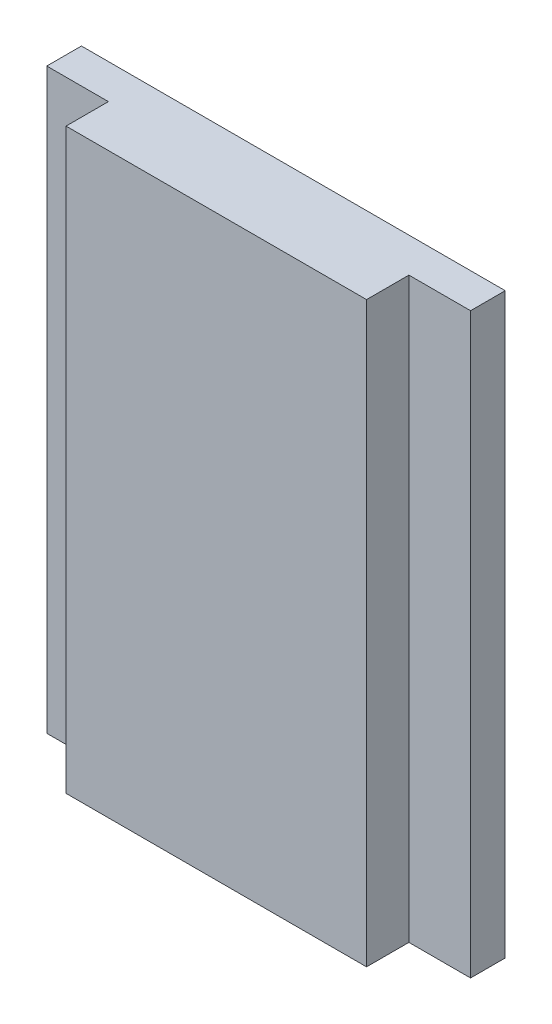
ISO-10303-21;
HEADER;
FILE_DESCRIPTION(('STEP AP214'),'2;1');
FILE_NAME('part.step','',(''),(''),'','','');
FILE_SCHEMA(('AUTOMOTIVE_DESIGN { 1 0 10303 214 1 1 1 1 }'));
ENDSEC;
DATA;
#1=APPLICATION_CONTEXT('core data for automotive mechanical design processes');
#2=APPLICATION_PROTOCOL_DEFINITION('international standard','automotive_design',2000,#1);
#3=PRODUCT_CONTEXT('',#1,'mechanical');
#4=PRODUCT('Part','Part','',(#3));
#5=PRODUCT_RELATED_PRODUCT_CATEGORY('part','',(#4));
#6=PRODUCT_DEFINITION_FORMATION('','',#4);
#7=PRODUCT_DEFINITION_CONTEXT('part definition',#1,'design');
#8=PRODUCT_DEFINITION('design','',#6,#7);
#9=PRODUCT_DEFINITION_SHAPE('','',#8);
#10=(LENGTH_UNIT() NAMED_UNIT(*) SI_UNIT(.MILLI.,.METRE.));
#11=(NAMED_UNIT(*) PLANE_ANGLE_UNIT() SI_UNIT($,.RADIAN.));
#12=(NAMED_UNIT(*) SI_UNIT($,.STERADIAN.) SOLID_ANGLE_UNIT());
#13=UNCERTAINTY_MEASURE_WITH_UNIT(LENGTH_MEASURE(1.E-05),#10,'distance_accuracy_value','');
#14=(GEOMETRIC_REPRESENTATION_CONTEXT(3) GLOBAL_UNCERTAINTY_ASSIGNED_CONTEXT((#13)) GLOBAL_UNIT_ASSIGNED_CONTEXT((#10,
#11,#12)) REPRESENTATION_CONTEXT('',''));
#15=CARTESIAN_POINT('',(0.,0.,0.));
#16=DIRECTION('',(0.,0.,1.));
#17=DIRECTION('',(1.,0.,0.));
#18=AXIS2_PLACEMENT_3D('',#15,#16,#17);
#19=CARTESIAN_POINT('',(-15.15,-7.5,-13.));
#20=DIRECTION('',(0.,0.,1.));
#21=DIRECTION('',(1.,0.,0.));
#22=AXIS2_PLACEMENT_3D('',#19,#20,#21);
#23=PLANE('',#22);
#24=DIRECTION('',(1.,0.,0.));
#25=VECTOR('',#24,1.);
#26=CARTESIAN_POINT('',(-15.15,7.5,-13.));
#27=LINE('',#26,#25);
#28=CARTESIAN_POINT('',(-15.15,7.5,-13.));
#29=VERTEX_POINT('',#28);
#30=CARTESIAN_POINT('',(-7.35,7.5,-13.));
#31=VERTEX_POINT('',#30);
#32=EDGE_CURVE('E113',#29,#31,#27,.T.);
#33=ORIENTED_EDGE('',*,*,#32,.F.);
#34=DIRECTION('',(0.,1.,0.));
#35=VECTOR('',#34,1.);
#36=CARTESIAN_POINT('',(-15.15,-7.5,-13.));
#37=LINE('',#36,#35);
#38=CARTESIAN_POINT('',(-15.15,-7.5,-13.));
#39=VERTEX_POINT('',#38);
#40=EDGE_CURVE('E11',#39,#29,#37,.T.);
#41=ORIENTED_EDGE('',*,*,#40,.F.);
#42=DIRECTION('',(1.,0.,0.));
#43=VECTOR('',#42,1.);
#44=CARTESIAN_POINT('',(-15.15,-7.5,-13.));
#45=LINE('',#44,#43);
#46=CARTESIAN_POINT('',(-7.35,-7.5,-13.));
#47=VERTEX_POINT('',#46);
#48=EDGE_CURVE('E152',#39,#47,#45,.T.);
#49=ORIENTED_EDGE('',*,*,#48,.T.);
#50=DIRECTION('',(0.,1.,0.));
#51=VECTOR('',#50,1.);
#52=CARTESIAN_POINT('',(-7.35,-7.5,-13.));
#53=LINE('',#52,#51);
#54=EDGE_CURVE('E140',#47,#31,#53,.T.);
#55=ORIENTED_EDGE('',*,*,#54,.T.);
#56=EDGE_LOOP('',(#33,#41,#49,#55));
#57=FACE_BOUND('',#56,.T.);
#58=ADVANCED_FACE('F36',(#57),#23,.T.);
#59=CARTESIAN_POINT('',(-15.15,-7.5,-14.1));
#60=DIRECTION('',(-1.,0.,0.));
#61=DIRECTION('',(0.,0.,1.));
#62=AXIS2_PLACEMENT_3D('',#59,#60,#61);
#63=PLANE('',#62);
#64=DIRECTION('',(0.,0.,1.));
#65=VECTOR('',#64,1.);
#66=CARTESIAN_POINT('',(-15.15,7.5,-14.1));
#67=LINE('',#66,#65);
#68=CARTESIAN_POINT('',(-15.15,7.5,-14.1));
#69=VERTEX_POINT('',#68);
#70=EDGE_CURVE('E161',#69,#29,#67,.T.);
#71=ORIENTED_EDGE('',*,*,#70,.F.);
#72=DIRECTION('',(0.,1.,0.));
#73=VECTOR('',#72,1.);
#74=CARTESIAN_POINT('',(-15.15,-7.5,-14.1));
#75=LINE('',#74,#73);
#76=CARTESIAN_POINT('',(-15.15,-7.5,-14.1));
#77=VERTEX_POINT('',#76);
#78=EDGE_CURVE('E46',#77,#69,#75,.T.);
#79=ORIENTED_EDGE('',*,*,#78,.F.);
#80=DIRECTION('',(0.,0.,1.));
#81=VECTOR('',#80,1.);
#82=CARTESIAN_POINT('',(-15.15,-7.5,-14.1));
#83=LINE('',#82,#81);
#84=EDGE_CURVE('E150',#77,#39,#83,.T.);
#85=ORIENTED_EDGE('',*,*,#84,.T.);
#86=ORIENTED_EDGE('',*,*,#40,.T.);
#87=EDGE_LOOP('',(#71,#79,#85,#86));
#88=FACE_BOUND('',#87,.T.);
#89=ADVANCED_FACE('F181',(#88),#63,.T.);
#90=CARTESIAN_POINT('',(-16.75,-7.5,-14.1));
#91=DIRECTION('',(0.,0.,1.));
#92=DIRECTION('',(1.,0.,0.));
#93=AXIS2_PLACEMENT_3D('',#90,#91,#92);
#94=PLANE('',#93);
#95=DIRECTION('',(1.,0.,0.));
#96=VECTOR('',#95,1.);
#97=CARTESIAN_POINT('',(-16.75,7.5,-14.1));
#98=LINE('',#97,#96);
#99=CARTESIAN_POINT('',(-16.75,7.5,-14.1));
#100=VERTEX_POINT('',#99);
#101=EDGE_CURVE('E158',#100,#69,#98,.T.);
#102=ORIENTED_EDGE('',*,*,#101,.F.);
#103=DIRECTION('',(0.,1.,0.));
#104=VECTOR('',#103,1.);
#105=CARTESIAN_POINT('',(-16.75,-7.5,-14.1));
#106=LINE('',#105,#104);
#107=CARTESIAN_POINT('',(-16.75,-7.5,-14.1));
#108=VERTEX_POINT('',#107);
#109=EDGE_CURVE('E164',#108,#100,#106,.T.);
#110=ORIENTED_EDGE('',*,*,#109,.F.);
#111=DIRECTION('',(1.,0.,0.));
#112=VECTOR('',#111,1.);
#113=CARTESIAN_POINT('',(-16.75,-7.5,-14.1));
#114=LINE('',#113,#112);
#115=EDGE_CURVE('E148',#108,#77,#114,.T.);
#116=ORIENTED_EDGE('',*,*,#115,.T.);
#117=ORIENTED_EDGE('',*,*,#78,.T.);
#118=EDGE_LOOP('',(#102,#110,#116,#117));
#119=FACE_BOUND('',#118,.T.);
#120=ADVANCED_FACE('F182',(#119),#94,.T.);
#121=CARTESIAN_POINT('',(-16.75,-7.5,-15.));
#122=DIRECTION('',(-1.,0.,0.));
#123=DIRECTION('',(0.,0.,1.));
#124=AXIS2_PLACEMENT_3D('',#121,#122,#123);
#125=PLANE('',#124);
#126=DIRECTION('',(0.,0.,1.));
#127=VECTOR('',#126,1.);
#128=CARTESIAN_POINT('',(-16.75,7.5,-15.));
#129=LINE('',#128,#127);
#130=CARTESIAN_POINT('',(-16.75,7.5,-15.));
#131=VERTEX_POINT('',#130);
#132=EDGE_CURVE('E155',#131,#100,#129,.T.);
#133=ORIENTED_EDGE('',*,*,#132,.F.);
#134=DIRECTION('',(0.,1.,0.));
#135=VECTOR('',#134,1.);
#136=CARTESIAN_POINT('',(-16.75,-7.5,-15.));
#137=LINE('',#136,#135);
#138=CARTESIAN_POINT('',(-16.75,-7.5,-15.));
#139=VERTEX_POINT('',#138);
#140=EDGE_CURVE('E40',#139,#131,#137,.T.);
#141=ORIENTED_EDGE('',*,*,#140,.F.);
#142=DIRECTION('',(0.,0.,1.));
#143=VECTOR('',#142,1.);
#144=CARTESIAN_POINT('',(-16.75,-7.5,-15.));
#145=LINE('',#144,#143);
#146=EDGE_CURVE('E112',#139,#108,#145,.T.);
#147=ORIENTED_EDGE('',*,*,#146,.T.);
#148=ORIENTED_EDGE('',*,*,#109,.T.);
#149=EDGE_LOOP('',(#133,#141,#147,#148));
#150=FACE_BOUND('',#149,.T.);
#151=ADVANCED_FACE('F167',(#150),#125,.T.);
#152=CARTESIAN_POINT('',(-15.15,-7.5,-15.));
#153=DIRECTION('',(0.,0.,-1.));
#154=DIRECTION('',(-1.,0.,0.));
#155=AXIS2_PLACEMENT_3D('',#152,#153,#154);
#156=PLANE('',#155);
#157=DIRECTION('',(-1.,0.,0.));
#158=VECTOR('',#157,1.);
#159=CARTESIAN_POINT('',(-15.15,7.5,-15.));
#160=LINE('',#159,#158);
#161=CARTESIAN_POINT('',(-5.75000000000001,7.5,-15.));
#162=VERTEX_POINT('',#161);
#163=EDGE_CURVE('E118',#162,#131,#160,.T.);
#164=ORIENTED_EDGE('',*,*,#163,.F.);
#165=DIRECTION('',(0.,1.,0.));
#166=VECTOR('',#165,1.);
#167=CARTESIAN_POINT('',(-5.75000000000001,-7.5,-15.));
#168=LINE('',#167,#166);
#169=CARTESIAN_POINT('',(-5.75000000000001,-7.5,-15.));
#170=VERTEX_POINT('',#169);
#171=EDGE_CURVE('E116',#170,#162,#168,.T.);
#172=ORIENTED_EDGE('',*,*,#171,.F.);
#173=DIRECTION('',(-1.,0.,0.));
#174=VECTOR('',#173,1.);
#175=CARTESIAN_POINT('',(-11.25,-7.5,-15.));
#176=LINE('',#175,#174);
#177=EDGE_CURVE('E80',#170,#139,#176,.T.);
#178=ORIENTED_EDGE('',*,*,#177,.T.);
#179=ORIENTED_EDGE('',*,*,#140,.T.);
#180=EDGE_LOOP('',(#164,#172,#178,#179));
#181=FACE_BOUND('',#180,.T.);
#182=ADVANCED_FACE('F38',(#181),#156,.T.);
#183=CARTESIAN_POINT('',(0.,-7.5,0.));
#184=DIRECTION('',(0.,1.,0.));
#185=DIRECTION('',(0.,0.,1.));
#186=AXIS2_PLACEMENT_3D('',#183,#184,#185);
#187=PLANE('',#186);
#188=ORIENTED_EDGE('',*,*,#177,.F.);
#189=DIRECTION('',(0.,0.,1.));
#190=VECTOR('',#189,1.);
#191=CARTESIAN_POINT('',(-5.75000000000001,-7.5,-15.));
#192=LINE('',#191,#190);
#193=CARTESIAN_POINT('',(-5.75000000000001,-7.5,-14.1));
#194=VERTEX_POINT('',#193);
#195=EDGE_CURVE('E108',#170,#194,#192,.T.);
#196=ORIENTED_EDGE('',*,*,#195,.T.);
#197=DIRECTION('',(-1.,0.,0.));
#198=VECTOR('',#197,1.);
#199=CARTESIAN_POINT('',(-5.75000000000001,-7.5,-14.1));
#200=LINE('',#199,#198);
#201=CARTESIAN_POINT('',(-7.35,-7.5,-14.1));
#202=VERTEX_POINT('',#201);
#203=EDGE_CURVE('E127',#194,#202,#200,.T.);
#204=ORIENTED_EDGE('',*,*,#203,.T.);
#205=DIRECTION('',(0.,0.,1.));
#206=VECTOR('',#205,1.);
#207=CARTESIAN_POINT('',(-7.35,-7.5,-14.1));
#208=LINE('',#207,#206);
#209=EDGE_CURVE('E122',#202,#47,#208,.T.);
#210=ORIENTED_EDGE('',*,*,#209,.T.);
#211=ORIENTED_EDGE('',*,*,#48,.F.);
#212=ORIENTED_EDGE('',*,*,#84,.F.);
#213=ORIENTED_EDGE('',*,*,#115,.F.);
#214=ORIENTED_EDGE('',*,*,#146,.F.);
#215=EDGE_LOOP('',(#188,#196,#204,#210,#211,#212,#213,#214));
#216=FACE_BOUND('',#215,.T.);
#217=ADVANCED_FACE('F106',(#216),#187,.F.);
#218=CARTESIAN_POINT('',(0.,7.5,0.));
#219=DIRECTION('',(0.,1.,0.));
#220=DIRECTION('',(0.,0.,1.));
#221=AXIS2_PLACEMENT_3D('',#218,#219,#220);
#222=PLANE('',#221);
#223=ORIENTED_EDGE('',*,*,#32,.T.);
#224=DIRECTION('',(0.,0.,1.));
#225=VECTOR('',#224,1.);
#226=CARTESIAN_POINT('',(-7.35,7.5,-14.1));
#227=LINE('',#226,#225);
#228=CARTESIAN_POINT('',(-7.35,7.5,-14.1));
#229=VERTEX_POINT('',#228);
#230=EDGE_CURVE('E128',#229,#31,#227,.T.);
#231=ORIENTED_EDGE('',*,*,#230,.F.);
#232=DIRECTION('',(-1.,0.,0.));
#233=VECTOR('',#232,1.);
#234=CARTESIAN_POINT('',(-5.75000000000001,7.5,-14.1));
#235=LINE('',#234,#233);
#236=CARTESIAN_POINT('',(-5.75000000000001,7.5,-14.1));
#237=VERTEX_POINT('',#236);
#238=EDGE_CURVE('E132',#237,#229,#235,.T.);
#239=ORIENTED_EDGE('',*,*,#238,.F.);
#240=DIRECTION('',(0.,0.,1.));
#241=VECTOR('',#240,1.);
#242=CARTESIAN_POINT('',(-5.75000000000001,7.5,-15.));
#243=LINE('',#242,#241);
#244=EDGE_CURVE('E137',#162,#237,#243,.T.);
#245=ORIENTED_EDGE('',*,*,#244,.F.);
#246=ORIENTED_EDGE('',*,*,#163,.T.);
#247=ORIENTED_EDGE('',*,*,#132,.T.);
#248=ORIENTED_EDGE('',*,*,#101,.T.);
#249=ORIENTED_EDGE('',*,*,#70,.T.);
#250=EDGE_LOOP('',(#223,#231,#239,#245,#246,#247,#248,#249));
#251=FACE_BOUND('',#250,.T.);
#252=ADVANCED_FACE('F169',(#251),#222,.T.);
#253=CARTESIAN_POINT('',(-7.35,-7.5,-14.1));
#254=DIRECTION('',(1.,0.,0.));
#255=DIRECTION('',(0.,0.,1.));
#256=AXIS2_PLACEMENT_3D('',#253,#254,#255);
#257=PLANE('',#256);
#258=ORIENTED_EDGE('',*,*,#230,.T.);
#259=ORIENTED_EDGE('',*,*,#54,.F.);
#260=ORIENTED_EDGE('',*,*,#209,.F.);
#261=DIRECTION('',(0.,1.,0.));
#262=VECTOR('',#261,1.);
#263=CARTESIAN_POINT('',(-7.35,-7.5,-14.1));
#264=LINE('',#263,#262);
#265=EDGE_CURVE('E143',#202,#229,#264,.T.);
#266=ORIENTED_EDGE('',*,*,#265,.T.);
#267=EDGE_LOOP('',(#258,#259,#260,#266));
#268=FACE_BOUND('',#267,.T.);
#269=ADVANCED_FACE('F180',(#268),#257,.T.);
#270=CARTESIAN_POINT('',(-5.75000000000001,-7.5,-14.1));
#271=DIRECTION('',(0.,0.,1.));
#272=DIRECTION('',(-1.,0.,0.));
#273=AXIS2_PLACEMENT_3D('',#270,#271,#272);
#274=PLANE('',#273);
#275=ORIENTED_EDGE('',*,*,#238,.T.);
#276=ORIENTED_EDGE('',*,*,#265,.F.);
#277=ORIENTED_EDGE('',*,*,#203,.F.);
#278=DIRECTION('',(0.,1.,0.));
#279=VECTOR('',#278,1.);
#280=CARTESIAN_POINT('',(-5.75000000000001,-7.5,-14.1));
#281=LINE('',#280,#279);
#282=EDGE_CURVE('E121',#194,#237,#281,.T.);
#283=ORIENTED_EDGE('',*,*,#282,.T.);
#284=EDGE_LOOP('',(#275,#276,#277,#283));
#285=FACE_BOUND('',#284,.T.);
#286=ADVANCED_FACE('F173',(#285),#274,.T.);
#287=CARTESIAN_POINT('',(-5.75000000000001,-7.5,-15.));
#288=DIRECTION('',(1.,0.,0.));
#289=DIRECTION('',(0.,0.,1.));
#290=AXIS2_PLACEMENT_3D('',#287,#288,#289);
#291=PLANE('',#290);
#292=ORIENTED_EDGE('',*,*,#244,.T.);
#293=ORIENTED_EDGE('',*,*,#282,.F.);
#294=ORIENTED_EDGE('',*,*,#195,.F.);
#295=ORIENTED_EDGE('',*,*,#171,.T.);
#296=EDGE_LOOP('',(#292,#293,#294,#295));
#297=FACE_BOUND('',#296,.T.);
#298=ADVANCED_FACE('F124',(#297),#291,.T.);
#299=CLOSED_SHELL('',(#58,#89,#120,#151,#182,#217,#252,#269,#286,#298));
#300=MANIFOLD_SOLID_BREP('B2',#299);
#301=ADVANCED_BREP_SHAPE_REPRESENTATION('',(#18,#300),#14);
#302=SHAPE_DEFINITION_REPRESENTATION(#9,#301);
ENDSEC;
END-ISO-10303-21;
